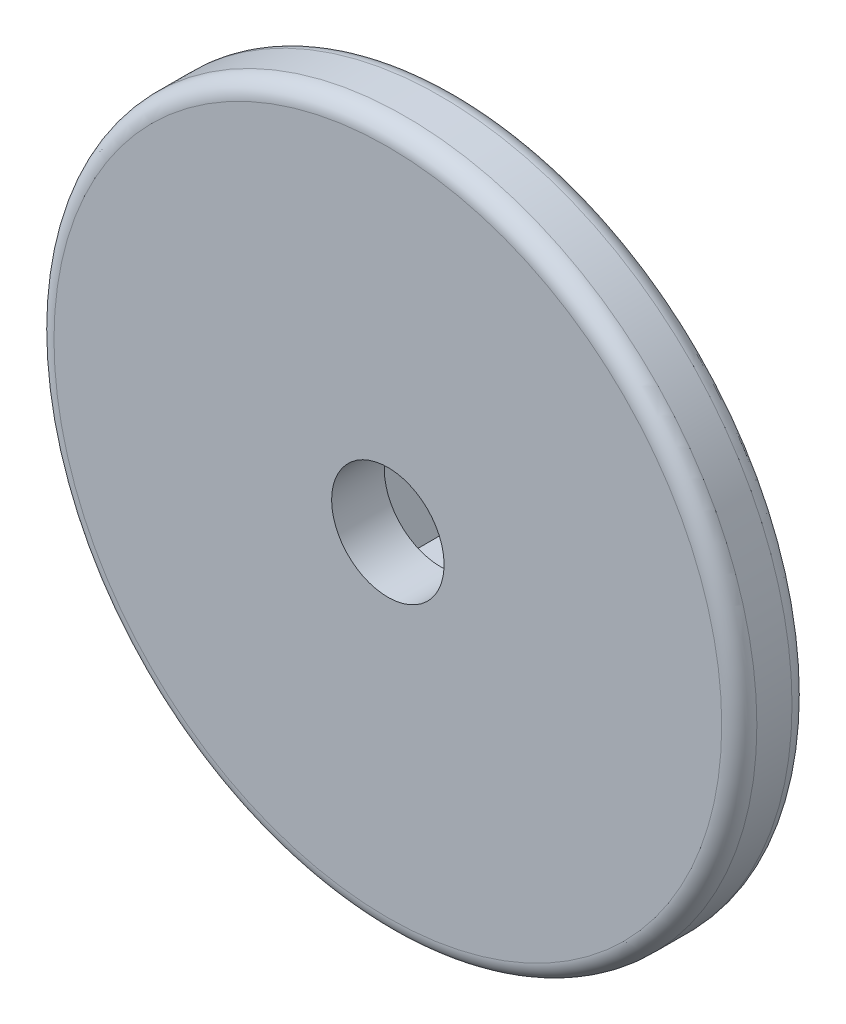
ISO-10303-21;
HEADER;
FILE_DESCRIPTION(('STEP AP214'),'2;1');
FILE_NAME('part.step','',(''),(''),'','','');
FILE_SCHEMA(('AUTOMOTIVE_DESIGN { 1 0 10303 214 1 1 1 1 }'));
ENDSEC;
DATA;
#1=APPLICATION_CONTEXT('core data for automotive mechanical design processes');
#2=APPLICATION_PROTOCOL_DEFINITION('international standard','automotive_design',2000,#1);
#3=PRODUCT_CONTEXT('',#1,'mechanical');
#4=PRODUCT('Part','Part','',(#3));
#5=PRODUCT_RELATED_PRODUCT_CATEGORY('part','',(#4));
#6=PRODUCT_DEFINITION_FORMATION('','',#4);
#7=PRODUCT_DEFINITION_CONTEXT('part definition',#1,'design');
#8=PRODUCT_DEFINITION('design','',#6,#7);
#9=PRODUCT_DEFINITION_SHAPE('','',#8);
#10=(LENGTH_UNIT() NAMED_UNIT(*) SI_UNIT(.MILLI.,.METRE.));
#11=(NAMED_UNIT(*) PLANE_ANGLE_UNIT() SI_UNIT($,.RADIAN.));
#12=(NAMED_UNIT(*) SI_UNIT($,.STERADIAN.) SOLID_ANGLE_UNIT());
#13=UNCERTAINTY_MEASURE_WITH_UNIT(LENGTH_MEASURE(1.E-05),#10,'distance_accuracy_value','');
#14=(GEOMETRIC_REPRESENTATION_CONTEXT(3) GLOBAL_UNCERTAINTY_ASSIGNED_CONTEXT((#13)) GLOBAL_UNIT_ASSIGNED_CONTEXT((#10,
#11,#12)) REPRESENTATION_CONTEXT('',''));
#15=CARTESIAN_POINT('',(0.,0.,0.));
#16=DIRECTION('',(0.,0.,1.));
#17=DIRECTION('',(1.,0.,0.));
#18=AXIS2_PLACEMENT_3D('',#15,#16,#17);
#19=CARTESIAN_POINT('',(0.,0.,0.));
#20=DIRECTION('',(0.,0.,-1.));
#21=DIRECTION('',(-1.,0.,0.));
#22=AXIS2_PLACEMENT_3D('',#19,#20,#21);
#23=CYLINDRICAL_SURFACE('',#22,1.6);
#24=CARTESIAN_POINT('',(0.,0.,0.));
#25=DIRECTION('',(0.,0.,-1.));
#26=DIRECTION('',(-1.,0.,0.));
#27=AXIS2_PLACEMENT_3D('',#24,#25,#26);
#28=CIRCLE('',#27,1.6);
#29=CARTESIAN_POINT('',(-1.6,0.,0.));
#30=VERTEX_POINT('',#29);
#31=EDGE_CURVE('E142',#30,#30,#28,.T.);
#32=ORIENTED_EDGE('',*,*,#31,.F.);
#33=EDGE_LOOP('',(#32));
#34=FACE_BOUND('',#33,.T.);
#35=CARTESIAN_POINT('',(0.,0.,-1.5));
#36=DIRECTION('',(0.,0.,-1.));
#37=DIRECTION('',(-1.,0.,0.));
#38=AXIS2_PLACEMENT_3D('',#35,#36,#37);
#39=CIRCLE('',#38,1.6);
#40=CARTESIAN_POINT('',(-1.6,0.,-1.5));
#41=VERTEX_POINT('',#40);
#42=EDGE_CURVE('E37',#41,#41,#39,.F.);
#43=ORIENTED_EDGE('',*,*,#42,.F.);
#44=EDGE_LOOP('',(#43));
#45=FACE_BOUND('',#44,.T.);
#46=ADVANCED_FACE('F33',(#34,#45),#23,.F.);
#47=CARTESIAN_POINT('',(0.,0.,0.));
#48=DIRECTION('',(0.,0.,-1.));
#49=DIRECTION('',(-1.,0.,0.));
#50=AXIS2_PLACEMENT_3D('',#47,#48,#49);
#51=PLANE('',#50);
#52=ORIENTED_EDGE('',*,*,#31,.T.);
#53=EDGE_LOOP('',(#52));
#54=FACE_BOUND('',#53,.T.);
#55=CARTESIAN_POINT('',(0.,0.,0.));
#56=DIRECTION('',(0.,0.,-1.));
#57=DIRECTION('',(-1.,0.,0.));
#58=AXIS2_PLACEMENT_3D('',#55,#56,#57);
#59=CIRCLE('',#58,9.5);
#60=CARTESIAN_POINT('',(-9.5,0.,0.));
#61=VERTEX_POINT('',#60);
#62=EDGE_CURVE('E11',#61,#61,#59,.T.);
#63=ORIENTED_EDGE('',*,*,#62,.F.);
#64=EDGE_LOOP('',(#63));
#65=FACE_BOUND('',#64,.T.);
#66=ADVANCED_FACE('F35',(#54,#65),#51,.F.);
#67=CARTESIAN_POINT('',(0.,0.,-0.5));
#68=DIRECTION('',(0.,0.,-1.));
#69=DIRECTION('',(-1.,0.,0.));
#70=AXIS2_PLACEMENT_3D('',#67,#68,#69);
#71=TOROIDAL_SURFACE('',#70,9.5,0.5);
#72=CARTESIAN_POINT('',(0.,0.,-0.500000000000003));
#73=DIRECTION('',(0.,0.,-1.));
#74=DIRECTION('',(-1.,0.,0.));
#75=AXIS2_PLACEMENT_3D('',#72,#73,#74);
#76=CIRCLE('',#75,10.);
#77=CARTESIAN_POINT('',(-10.,0.,-0.500000000000003));
#78=VERTEX_POINT('',#77);
#79=EDGE_CURVE('E42',#78,#78,#76,.T.);
#80=ORIENTED_EDGE('',*,*,#79,.F.);
#81=EDGE_LOOP('',(#80));
#82=FACE_BOUND('',#81,.T.);
#83=ORIENTED_EDGE('',*,*,#62,.T.);
#84=EDGE_LOOP('',(#83));
#85=FACE_BOUND('',#84,.T.);
#86=ADVANCED_FACE('F168',(#82,#85),#71,.T.);
#87=CARTESIAN_POINT('',(0.,0.,-3.5));
#88=DIRECTION('',(0.,0.,-1.));
#89=DIRECTION('',(-1.,0.,0.));
#90=AXIS2_PLACEMENT_3D('',#87,#88,#89);
#91=CYLINDRICAL_SURFACE('',#90,10.);
#92=CARTESIAN_POINT('',(0.,0.,-1.5));
#93=DIRECTION('',(0.,0.,-1.));
#94=DIRECTION('',(-1.,0.,0.));
#95=AXIS2_PLACEMENT_3D('',#92,#93,#94);
#96=CIRCLE('',#95,10.);
#97=CARTESIAN_POINT('',(-10.,0.,-1.5));
#98=VERTEX_POINT('',#97);
#99=EDGE_CURVE('E160',#98,#98,#96,.T.);
#100=ORIENTED_EDGE('',*,*,#99,.F.);
#101=EDGE_LOOP('',(#100));
#102=FACE_BOUND('',#101,.T.);
#103=ORIENTED_EDGE('',*,*,#79,.T.);
#104=EDGE_LOOP('',(#103));
#105=FACE_BOUND('',#104,.T.);
#106=ADVANCED_FACE('F166',(#102,#105),#91,.T.);
#107=CARTESIAN_POINT('',(0.,0.,-1.5));
#108=DIRECTION('',(0.,0.,-1.));
#109=DIRECTION('',(-1.,0.,0.));
#110=AXIS2_PLACEMENT_3D('',#107,#108,#109);
#111=TOROIDAL_SURFACE('',#110,9.5,0.5);
#112=CARTESIAN_POINT('',(0.,0.,-2.));
#113=DIRECTION('',(0.,0.,-1.));
#114=DIRECTION('',(-1.,0.,0.));
#115=AXIS2_PLACEMENT_3D('',#112,#113,#114);
#116=CIRCLE('',#115,9.5);
#117=CARTESIAN_POINT('',(-9.5,0.,-2.));
#118=VERTEX_POINT('',#117);
#119=EDGE_CURVE('E157',#118,#118,#116,.T.);
#120=ORIENTED_EDGE('',*,*,#119,.F.);
#121=EDGE_LOOP('',(#120));
#122=FACE_BOUND('',#121,.T.);
#123=ORIENTED_EDGE('',*,*,#99,.T.);
#124=EDGE_LOOP('',(#123));
#125=FACE_BOUND('',#124,.T.);
#126=ADVANCED_FACE('F226',(#122,#125),#111,.T.);
#127=CARTESIAN_POINT('',(9.5,0.,-2.));
#128=DIRECTION('',(0.,0.,1.));
#129=DIRECTION('',(1.,0.,0.));
#130=AXIS2_PLACEMENT_3D('',#127,#128,#129);
#131=PLANE('',#130);
#132=CARTESIAN_POINT('',(0.,0.,-2.));
#133=DIRECTION('',(0.,0.,-1.));
#134=DIRECTION('',(-1.,0.,0.));
#135=AXIS2_PLACEMENT_3D('',#132,#133,#134);
#136=CIRCLE('',#135,7.);
#137=CARTESIAN_POINT('',(-7.,0.,-2.));
#138=VERTEX_POINT('',#137);
#139=EDGE_CURVE('E154',#138,#138,#136,.T.);
#140=ORIENTED_EDGE('',*,*,#139,.F.);
#141=EDGE_LOOP('',(#140));
#142=FACE_BOUND('',#141,.T.);
#143=ORIENTED_EDGE('',*,*,#119,.T.);
#144=EDGE_LOOP('',(#143));
#145=FACE_BOUND('',#144,.T.);
#146=ADVANCED_FACE('F222',(#142,#145),#131,.F.);
#147=CARTESIAN_POINT('',(0.,0.,-2.));
#148=DIRECTION('',(0.,0.,1.));
#149=DIRECTION('',(1.,0.,0.));
#150=AXIS2_PLACEMENT_3D('',#147,#148,#149);
#151=CONICAL_SURFACE('',#150,7.,0.38352751595699);
#152=CARTESIAN_POINT('',(0.,0.,-4.));
#153=DIRECTION('',(0.,0.,-1.));
#154=DIRECTION('',(-1.,0.,0.));
#155=AXIS2_PLACEMENT_3D('',#152,#153,#154);
#156=CIRCLE('',#155,6.19298245614035);
#157=CARTESIAN_POINT('',(-6.19298245614035,0.,-4.));
#158=VERTEX_POINT('',#157);
#159=EDGE_CURVE('E151',#158,#158,#156,.T.);
#160=ORIENTED_EDGE('',*,*,#159,.F.);
#161=EDGE_LOOP('',(#160));
#162=FACE_BOUND('',#161,.T.);
#163=ORIENTED_EDGE('',*,*,#139,.T.);
#164=EDGE_LOOP('',(#163));
#165=FACE_BOUND('',#164,.T.);
#166=ADVANCED_FACE('F218',(#162,#165),#151,.T.);
#167=CARTESIAN_POINT('',(6.19298245614035,0.,-4.));
#168=DIRECTION('',(0.,0.,1.));
#169=DIRECTION('',(1.,0.,0.));
#170=AXIS2_PLACEMENT_3D('',#167,#168,#169);
#171=PLANE('',#170);
#172=CARTESIAN_POINT('',(0.,0.,-4.));
#173=DIRECTION('',(0.,0.,-1.));
#174=DIRECTION('',(-1.,0.,0.));
#175=AXIS2_PLACEMENT_3D('',#172,#173,#174);
#176=CIRCLE('',#175,4.69298245614035);
#177=CARTESIAN_POINT('',(-4.69298245614035,0.,-4.));
#178=VERTEX_POINT('',#177);
#179=EDGE_CURVE('E148',#178,#178,#176,.T.);
#180=ORIENTED_EDGE('',*,*,#179,.F.);
#181=EDGE_LOOP('',(#180));
#182=FACE_BOUND('',#181,.T.);
#183=ORIENTED_EDGE('',*,*,#159,.T.);
#184=EDGE_LOOP('',(#183));
#185=FACE_BOUND('',#184,.T.);
#186=ADVANCED_FACE('F214',(#182,#185),#171,.F.);
#187=CARTESIAN_POINT('',(0.,0.,-4.));
#188=DIRECTION('',(0.,0.,-1.));
#189=DIRECTION('',(-1.,0.,0.));
#190=AXIS2_PLACEMENT_3D('',#187,#188,#189);
#191=CONICAL_SURFACE('',#190,4.69298245614035,0.92092587738295);
#192=CARTESIAN_POINT('',(0.,0.,-3.5));
#193=DIRECTION('',(0.,0.,-1.));
#194=DIRECTION('',(-1.,0.,0.));
#195=AXIS2_PLACEMENT_3D('',#192,#193,#194);
#196=CIRCLE('',#195,4.03508771929825);
#197=CARTESIAN_POINT('',(-4.03508771929825,0.,-3.5));
#198=VERTEX_POINT('',#197);
#199=EDGE_CURVE('E145',#198,#198,#196,.T.);
#200=ORIENTED_EDGE('',*,*,#199,.F.);
#201=EDGE_LOOP('',(#200));
#202=FACE_BOUND('',#201,.T.);
#203=ORIENTED_EDGE('',*,*,#179,.T.);
#204=EDGE_LOOP('',(#203));
#205=FACE_BOUND('',#204,.T.);
#206=ADVANCED_FACE('F194',(#202,#205),#191,.F.);
#207=CARTESIAN_POINT('',(4.03508771929825,0.,-3.5));
#208=DIRECTION('',(0.,0.,1.));
#209=DIRECTION('',(1.,0.,0.));
#210=AXIS2_PLACEMENT_3D('',#207,#208,#209);
#211=PLANE('',#210);
#212=DIRECTION('',(-0.997294866939456,0.0735047507050547,0.));
#213=VECTOR('',#212,1.);
#214=CARTESIAN_POINT('',(1.35616601479646,-2.80727870727349,-3.5));
#215=LINE('',#214,#213);
#216=CARTESIAN_POINT('',(1.35616601479646,-2.80727870727349,-3.5));
#217=VERTEX_POINT('',#216);
#218=CARTESIAN_POINT('',(-1.75309166860375,-2.57811357419958,-3.5));
#219=VERTEX_POINT('',#218);
#220=EDGE_CURVE('E124',#217,#219,#215,.T.);
#221=ORIENTED_EDGE('',*,*,#220,.F.);
#222=DIRECTION('',(-0.562304414879147,-0.826930314480864,0.));
#223=VECTOR('',#222,1.);
#224=CARTESIAN_POINT('',(3.10925768340021,-0.229165133073909,-3.5));
#225=LINE('',#224,#223);
#226=CARTESIAN_POINT('',(3.10925768340021,-0.229165133073909,-3.5));
#227=VERTEX_POINT('',#226);
#228=EDGE_CURVE('E49',#227,#217,#225,.T.);
#229=ORIENTED_EDGE('',*,*,#228,.F.);
#230=DIRECTION('',(0.434990452060309,-0.900435065185918,0.));
#231=VECTOR('',#230,1.);
#232=CARTESIAN_POINT('',(1.75309166860375,2.57811357419958,-3.5));
#233=LINE('',#232,#231);
#234=CARTESIAN_POINT('',(1.75309166860375,2.57811357419958,-3.5));
#235=VERTEX_POINT('',#234);
#236=EDGE_CURVE('E133',#235,#227,#233,.T.);
#237=ORIENTED_EDGE('',*,*,#236,.F.);
#238=DIRECTION('',(0.997294866939456,-0.0735047507050546,0.));
#239=VECTOR('',#238,1.);
#240=CARTESIAN_POINT('',(-1.35616601479646,2.80727870727349,-3.5));
#241=LINE('',#240,#239);
#242=CARTESIAN_POINT('',(-1.35616601479646,2.80727870727349,-3.5));
#243=VERTEX_POINT('',#242);
#244=EDGE_CURVE('E131',#243,#235,#241,.T.);
#245=ORIENTED_EDGE('',*,*,#244,.F.);
#246=DIRECTION('',(0.562304414879147,0.826930314480864,0.));
#247=VECTOR('',#246,1.);
#248=CARTESIAN_POINT('',(-3.10925768340021,0.22916513307391,-3.5));
#249=LINE('',#248,#247);
#250=CARTESIAN_POINT('',(-3.10925768340021,0.22916513307391,-3.5));
#251=VERTEX_POINT('',#250);
#252=EDGE_CURVE('E97',#251,#243,#249,.T.);
#253=ORIENTED_EDGE('',*,*,#252,.F.);
#254=DIRECTION('',(-0.434990452060309,0.900435065185918,0.));
#255=VECTOR('',#254,1.);
#256=CARTESIAN_POINT('',(-1.75309166860375,-2.57811357419958,-3.5));
#257=LINE('',#256,#255);
#258=EDGE_CURVE('E127',#219,#251,#257,.T.);
#259=ORIENTED_EDGE('',*,*,#258,.F.);
#260=EDGE_LOOP('',(#221,#229,#237,#245,#253,#259));
#261=FACE_BOUND('',#260,.T.);
#262=ORIENTED_EDGE('',*,*,#199,.T.);
#263=EDGE_LOOP('',(#262));
#264=FACE_BOUND('',#263,.T.);
#265=ADVANCED_FACE('F186',(#261,#264),#211,.F.);
#266=CARTESIAN_POINT('',(0.,0.,-1.5));
#267=DIRECTION('',(0.,0.,-1.));
#268=DIRECTION('',(-1.,0.,0.));
#269=AXIS2_PLACEMENT_3D('',#266,#267,#268);
#270=PLANE('',#269);
#271=DIRECTION('',(-0.562304414879147,-0.826930314480864,0.));
#272=VECTOR('',#271,1.);
#273=CARTESIAN_POINT('',(3.10925768340021,-0.229165133073909,-1.5));
#274=LINE('',#273,#272);
#275=CARTESIAN_POINT('',(3.10925768340021,-0.229165133073909,-1.5));
#276=VERTEX_POINT('',#275);
#277=CARTESIAN_POINT('',(1.35616601479646,-2.80727870727349,-1.5));
#278=VERTEX_POINT('',#277);
#279=EDGE_CURVE('E135',#276,#278,#274,.T.);
#280=ORIENTED_EDGE('',*,*,#279,.T.);
#281=DIRECTION('',(-0.997294866939456,0.0735047507050547,0.));
#282=VECTOR('',#281,1.);
#283=CARTESIAN_POINT('',(1.35616601479646,-2.80727870727349,-1.5));
#284=LINE('',#283,#282);
#285=CARTESIAN_POINT('',(-1.75309166860375,-2.57811357419958,-1.5));
#286=VERTEX_POINT('',#285);
#287=EDGE_CURVE('E118',#278,#286,#284,.T.);
#288=ORIENTED_EDGE('',*,*,#287,.T.);
#289=DIRECTION('',(-0.434990452060309,0.900435065185918,0.));
#290=VECTOR('',#289,1.);
#291=CARTESIAN_POINT('',(-1.75309166860375,-2.57811357419958,-1.5));
#292=LINE('',#291,#290);
#293=CARTESIAN_POINT('',(-3.10925768340021,0.22916513307391,-1.5));
#294=VERTEX_POINT('',#293);
#295=EDGE_CURVE('E116',#286,#294,#292,.T.);
#296=ORIENTED_EDGE('',*,*,#295,.T.);
#297=DIRECTION('',(0.562304414879147,0.826930314480864,0.));
#298=VECTOR('',#297,1.);
#299=CARTESIAN_POINT('',(-3.10925768340021,0.22916513307391,-1.5));
#300=LINE('',#299,#298);
#301=CARTESIAN_POINT('',(-1.35616601479646,2.80727870727349,-1.5));
#302=VERTEX_POINT('',#301);
#303=EDGE_CURVE('E94',#294,#302,#300,.T.);
#304=ORIENTED_EDGE('',*,*,#303,.T.);
#305=DIRECTION('',(0.997294866939456,-0.0735047507050546,0.));
#306=VECTOR('',#305,1.);
#307=CARTESIAN_POINT('',(-1.35616601479646,2.80727870727349,-1.5));
#308=LINE('',#307,#306);
#309=CARTESIAN_POINT('',(1.75309166860375,2.57811357419958,-1.5));
#310=VERTEX_POINT('',#309);
#311=EDGE_CURVE('E105',#302,#310,#308,.T.);
#312=ORIENTED_EDGE('',*,*,#311,.T.);
#313=DIRECTION('',(0.434990452060309,-0.900435065185918,0.));
#314=VECTOR('',#313,1.);
#315=CARTESIAN_POINT('',(1.75309166860375,2.57811357419958,-1.5));
#316=LINE('',#315,#314);
#317=EDGE_CURVE('E109',#310,#276,#316,.T.);
#318=ORIENTED_EDGE('',*,*,#317,.T.);
#319=EDGE_LOOP('',(#280,#288,#296,#304,#312,#318));
#320=FACE_BOUND('',#319,.T.);
#321=ORIENTED_EDGE('',*,*,#42,.T.);
#322=EDGE_LOOP('',(#321));
#323=FACE_BOUND('',#322,.T.);
#324=ADVANCED_FACE('F112',(#320,#323),#270,.T.);
#325=CARTESIAN_POINT('',(3.10925768340021,-0.229165133073909,-1.5));
#326=DIRECTION('',(0.826930314480864,-0.562304414879147,0.));
#327=DIRECTION('',(0.562304414879147,0.826930314480864,0.));
#328=AXIS2_PLACEMENT_3D('',#325,#326,#327);
#329=PLANE('',#328);
#330=ORIENTED_EDGE('',*,*,#228,.T.);
#331=DIRECTION('',(0.,0.,-1.));
#332=VECTOR('',#331,1.);
#333=CARTESIAN_POINT('',(1.35616601479646,-2.80727870727349,-1.5));
#334=LINE('',#333,#332);
#335=EDGE_CURVE('E79',#278,#217,#334,.T.);
#336=ORIENTED_EDGE('',*,*,#335,.F.);
#337=ORIENTED_EDGE('',*,*,#279,.F.);
#338=DIRECTION('',(0.,0.,-1.));
#339=VECTOR('',#338,1.);
#340=CARTESIAN_POINT('',(3.10925768340021,-0.229165133073909,-1.5));
#341=LINE('',#340,#339);
#342=EDGE_CURVE('E57',#276,#227,#341,.T.);
#343=ORIENTED_EDGE('',*,*,#342,.T.);
#344=EDGE_LOOP('',(#330,#336,#337,#343));
#345=FACE_BOUND('',#344,.T.);
#346=ADVANCED_FACE('F185',(#345),#329,.F.);
#347=CARTESIAN_POINT('',(1.75309166860375,2.57811357419958,-1.5));
#348=DIRECTION('',(0.900435065185918,0.434990452060309,0.));
#349=DIRECTION('',(-0.434990452060309,0.900435065185918,0.));
#350=AXIS2_PLACEMENT_3D('',#347,#348,#349);
#351=PLANE('',#350);
#352=ORIENTED_EDGE('',*,*,#236,.T.);
#353=ORIENTED_EDGE('',*,*,#342,.F.);
#354=ORIENTED_EDGE('',*,*,#317,.F.);
#355=DIRECTION('',(0.,0.,-1.));
#356=VECTOR('',#355,1.);
#357=CARTESIAN_POINT('',(1.75309166860375,2.57811357419958,-1.5));
#358=LINE('',#357,#356);
#359=EDGE_CURVE('E101',#310,#235,#358,.T.);
#360=ORIENTED_EDGE('',*,*,#359,.T.);
#361=EDGE_LOOP('',(#352,#353,#354,#360));
#362=FACE_BOUND('',#361,.T.);
#363=ADVANCED_FACE('F192',(#362),#351,.F.);
#364=CARTESIAN_POINT('',(-1.35616601479646,2.80727870727349,-1.5));
#365=DIRECTION('',(0.0735047507050546,0.997294866939456,0.));
#366=DIRECTION('',(-0.997294866939456,0.0735047507050546,0.));
#367=AXIS2_PLACEMENT_3D('',#364,#365,#366);
#368=PLANE('',#367);
#369=ORIENTED_EDGE('',*,*,#244,.T.);
#370=ORIENTED_EDGE('',*,*,#359,.F.);
#371=ORIENTED_EDGE('',*,*,#311,.F.);
#372=DIRECTION('',(0.,0.,-1.));
#373=VECTOR('',#372,1.);
#374=CARTESIAN_POINT('',(-1.35616601479646,2.80727870727349,-1.5));
#375=LINE('',#374,#373);
#376=EDGE_CURVE('E90',#302,#243,#375,.T.);
#377=ORIENTED_EDGE('',*,*,#376,.T.);
#378=EDGE_LOOP('',(#369,#370,#371,#377));
#379=FACE_BOUND('',#378,.T.);
#380=ADVANCED_FACE('F106',(#379),#368,.F.);
#381=CARTESIAN_POINT('',(-3.10925768340021,0.22916513307391,-1.5));
#382=DIRECTION('',(-0.826930314480864,0.562304414879147,0.));
#383=DIRECTION('',(-0.562304414879147,-0.826930314480864,0.));
#384=AXIS2_PLACEMENT_3D('',#381,#382,#383);
#385=PLANE('',#384);
#386=ORIENTED_EDGE('',*,*,#252,.T.);
#387=ORIENTED_EDGE('',*,*,#376,.F.);
#388=ORIENTED_EDGE('',*,*,#303,.F.);
#389=DIRECTION('',(0.,0.,-1.));
#390=VECTOR('',#389,1.);
#391=CARTESIAN_POINT('',(-3.10925768340021,0.22916513307391,-1.5));
#392=LINE('',#391,#390);
#393=EDGE_CURVE('E102',#294,#251,#392,.T.);
#394=ORIENTED_EDGE('',*,*,#393,.T.);
#395=EDGE_LOOP('',(#386,#387,#388,#394));
#396=FACE_BOUND('',#395,.T.);
#397=ADVANCED_FACE('F92',(#396),#385,.F.);
#398=CARTESIAN_POINT('',(-1.75309166860375,-2.57811357419958,-1.5));
#399=DIRECTION('',(-0.900435065185918,-0.434990452060309,0.));
#400=DIRECTION('',(0.434990452060309,-0.900435065185918,0.));
#401=AXIS2_PLACEMENT_3D('',#398,#399,#400);
#402=PLANE('',#401);
#403=ORIENTED_EDGE('',*,*,#258,.T.);
#404=ORIENTED_EDGE('',*,*,#393,.F.);
#405=ORIENTED_EDGE('',*,*,#295,.F.);
#406=DIRECTION('',(0.,0.,-1.));
#407=VECTOR('',#406,1.);
#408=CARTESIAN_POINT('',(-1.75309166860375,-2.57811357419958,-1.5));
#409=LINE('',#408,#407);
#410=EDGE_CURVE('E139',#286,#219,#409,.T.);
#411=ORIENTED_EDGE('',*,*,#410,.T.);
#412=EDGE_LOOP('',(#403,#404,#405,#411));
#413=FACE_BOUND('',#412,.T.);
#414=ADVANCED_FACE('F204',(#413),#402,.F.);
#415=CARTESIAN_POINT('',(1.35616601479646,-2.80727870727349,-1.5));
#416=DIRECTION('',(-0.0735047507050547,-0.997294866939456,0.));
#417=DIRECTION('',(0.997294866939456,-0.0735047507050547,0.));
#418=AXIS2_PLACEMENT_3D('',#415,#416,#417);
#419=PLANE('',#418);
#420=ORIENTED_EDGE('',*,*,#220,.T.);
#421=ORIENTED_EDGE('',*,*,#410,.F.);
#422=ORIENTED_EDGE('',*,*,#287,.F.);
#423=ORIENTED_EDGE('',*,*,#335,.T.);
#424=EDGE_LOOP('',(#420,#421,#422,#423));
#425=FACE_BOUND('',#424,.T.);
#426=ADVANCED_FACE('F207',(#425),#419,.F.);
#427=CLOSED_SHELL('',(#46,#66,#86,#106,#126,#146,#166,#186,#206,#265,#324,#346,#363,#380,#397,
#414,#426));
#428=MANIFOLD_SOLID_BREP('B2',#427);
#429=ADVANCED_BREP_SHAPE_REPRESENTATION('',(#18,#428),#14);
#430=SHAPE_DEFINITION_REPRESENTATION(#9,#429);
ENDSEC;
END-ISO-10303-21;
